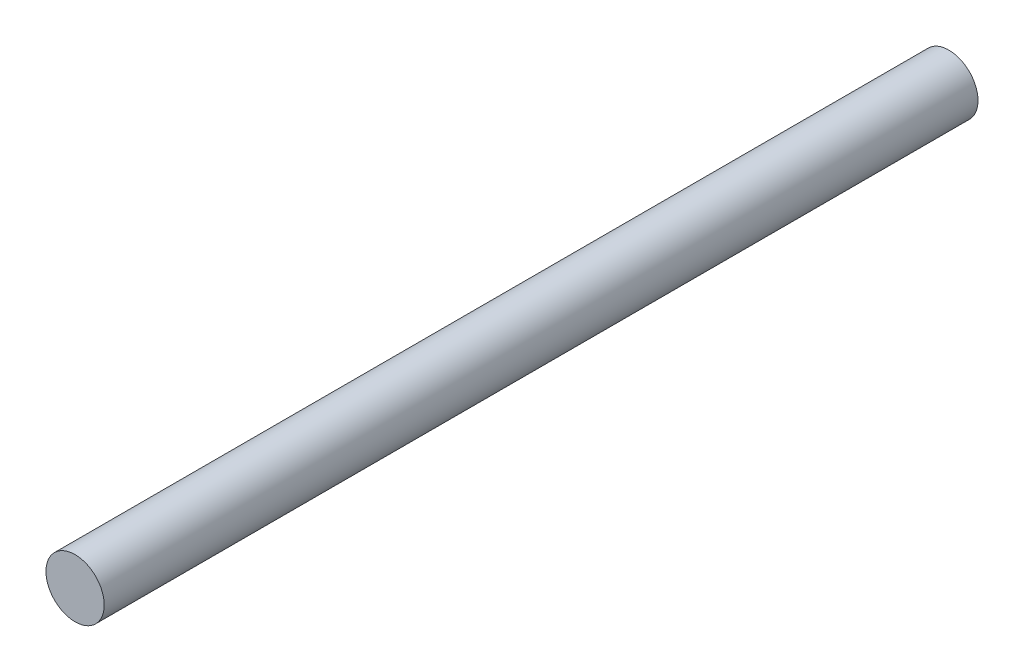
ISO-10303-21;
HEADER;
FILE_DESCRIPTION(('STEP AP214'),'2;1');
FILE_NAME('part.step','',(''),(''),'','','');
FILE_SCHEMA(('AUTOMOTIVE_DESIGN { 1 0 10303 214 1 1 1 1 }'));
ENDSEC;
DATA;
#1=APPLICATION_CONTEXT('core data for automotive mechanical design processes');
#2=APPLICATION_PROTOCOL_DEFINITION('international standard','automotive_design',2000,#1);
#3=PRODUCT_CONTEXT('',#1,'mechanical');
#4=PRODUCT('Part','Part','',(#3));
#5=PRODUCT_RELATED_PRODUCT_CATEGORY('part','',(#4));
#6=PRODUCT_DEFINITION_FORMATION('','',#4);
#7=PRODUCT_DEFINITION_CONTEXT('part definition',#1,'design');
#8=PRODUCT_DEFINITION('design','',#6,#7);
#9=PRODUCT_DEFINITION_SHAPE('','',#8);
#10=(LENGTH_UNIT() NAMED_UNIT(*) SI_UNIT(.MILLI.,.METRE.));
#11=(NAMED_UNIT(*) PLANE_ANGLE_UNIT() SI_UNIT($,.RADIAN.));
#12=(NAMED_UNIT(*) SI_UNIT($,.STERADIAN.) SOLID_ANGLE_UNIT());
#13=UNCERTAINTY_MEASURE_WITH_UNIT(LENGTH_MEASURE(1.E-05),#10,'distance_accuracy_value','');
#14=(GEOMETRIC_REPRESENTATION_CONTEXT(3) GLOBAL_UNCERTAINTY_ASSIGNED_CONTEXT((#13)) GLOBAL_UNIT_ASSIGNED_CONTEXT((#10,
#11,#12)) REPRESENTATION_CONTEXT('',''));
#15=CARTESIAN_POINT('',(0.,0.,0.));
#16=DIRECTION('',(0.,0.,1.));
#17=DIRECTION('',(1.,0.,0.));
#18=AXIS2_PLACEMENT_3D('',#15,#16,#17);
#19=CARTESIAN_POINT('',(0.,0.,30.));
#20=DIRECTION('',(0.,0.,-1.));
#21=DIRECTION('',(-1.,0.,0.));
#22=AXIS2_PLACEMENT_3D('',#19,#20,#21);
#23=CYLINDRICAL_SURFACE('',#22,1.);
#24=CARTESIAN_POINT('',(0.,0.,30.));
#25=DIRECTION('',(0.,0.,1.));
#26=DIRECTION('',(1.,0.,0.));
#27=AXIS2_PLACEMENT_3D('',#24,#25,#26);
#28=CIRCLE('',#27,1.);
#29=CARTESIAN_POINT('',(1.,0.,30.));
#30=VERTEX_POINT('',#29);
#31=EDGE_CURVE('E10',#30,#30,#28,.T.);
#32=ORIENTED_EDGE('',*,*,#31,.F.);
#33=EDGE_LOOP('',(#32));
#34=FACE_BOUND('',#33,.T.);
#35=CARTESIAN_POINT('',(0.,0.,0.));
#36=DIRECTION('',(0.,0.,1.));
#37=DIRECTION('',(1.,0.,0.));
#38=AXIS2_PLACEMENT_3D('',#35,#36,#37);
#39=CIRCLE('',#38,1.);
#40=CARTESIAN_POINT('',(1.,0.,0.));
#41=VERTEX_POINT('',#40);
#42=EDGE_CURVE('E34',#41,#41,#39,.T.);
#43=ORIENTED_EDGE('',*,*,#42,.T.);
#44=EDGE_LOOP('',(#43));
#45=FACE_BOUND('',#44,.T.);
#46=ADVANCED_FACE('F31',(#34,#45),#23,.T.);
#47=CARTESIAN_POINT('',(0.,0.,30.));
#48=DIRECTION('',(0.,0.,1.));
#49=DIRECTION('',(1.,0.,0.));
#50=AXIS2_PLACEMENT_3D('',#47,#48,#49);
#51=PLANE('',#50);
#52=ORIENTED_EDGE('',*,*,#31,.T.);
#53=EDGE_LOOP('',(#52));
#54=FACE_BOUND('',#53,.T.);
#55=ADVANCED_FACE('F46',(#54),#51,.T.);
#56=CARTESIAN_POINT('',(0.,0.,0.));
#57=DIRECTION('',(0.,0.,1.));
#58=DIRECTION('',(1.,0.,0.));
#59=AXIS2_PLACEMENT_3D('',#56,#57,#58);
#60=PLANE('',#59);
#61=ORIENTED_EDGE('',*,*,#42,.F.);
#62=EDGE_LOOP('',(#61));
#63=FACE_BOUND('',#62,.T.);
#64=ADVANCED_FACE('F44',(#63),#60,.F.);
#65=CLOSED_SHELL('',(#46,#55,#64));
#66=MANIFOLD_SOLID_BREP('B2',#65);
#67=ADVANCED_BREP_SHAPE_REPRESENTATION('',(#18,#66),#14);
#68=SHAPE_DEFINITION_REPRESENTATION(#9,#67);
ENDSEC;
END-ISO-10303-21;
